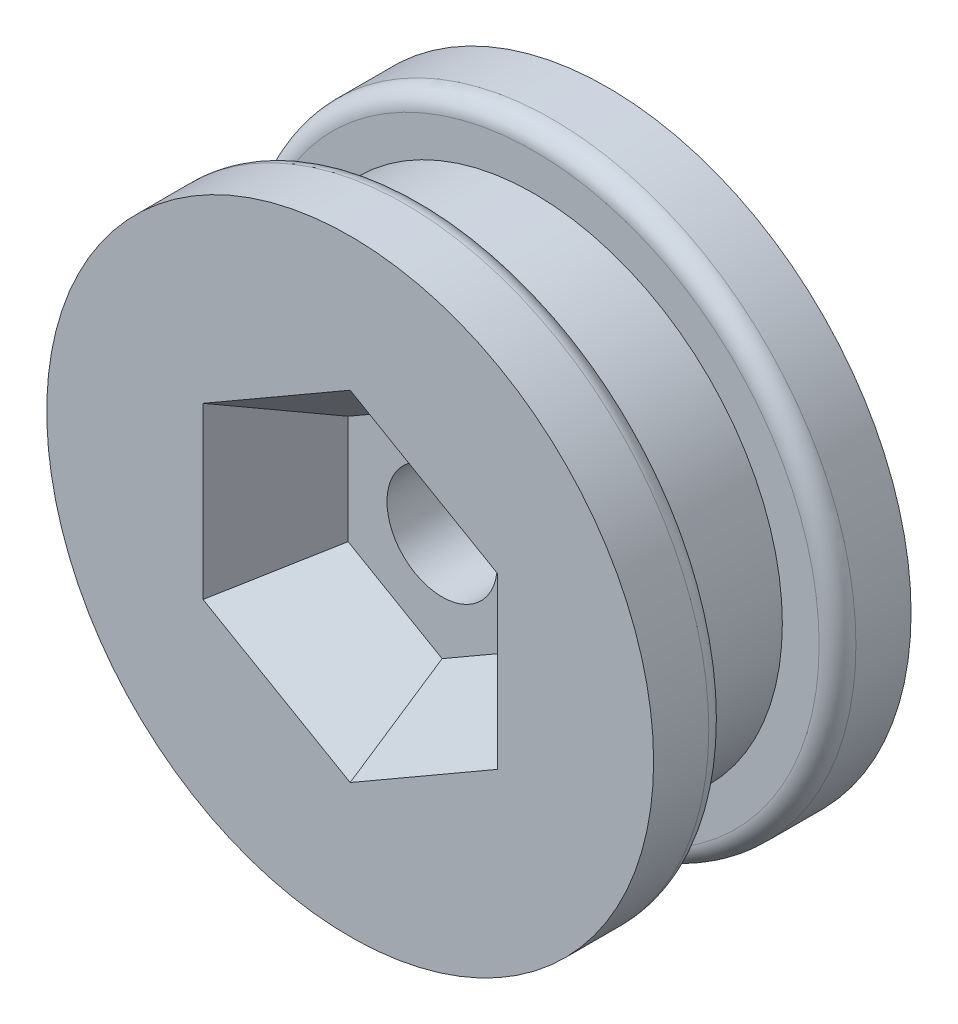
ISO-10303-21;
HEADER;
FILE_DESCRIPTION(('STEP AP214'),'2;1');
FILE_NAME('part.step','',(''),(''),'','','');
FILE_SCHEMA(('AUTOMOTIVE_DESIGN { 1 0 10303 214 1 1 1 1 }'));
ENDSEC;
DATA;
#1=APPLICATION_CONTEXT('core data for automotive mechanical design processes');
#2=APPLICATION_PROTOCOL_DEFINITION('international standard','automotive_design',2000,#1);
#3=PRODUCT_CONTEXT('',#1,'mechanical');
#4=PRODUCT('Part','Part','',(#3));
#5=PRODUCT_RELATED_PRODUCT_CATEGORY('part','',(#4));
#6=PRODUCT_DEFINITION_FORMATION('','',#4);
#7=PRODUCT_DEFINITION_CONTEXT('part definition',#1,'design');
#8=PRODUCT_DEFINITION('design','',#6,#7);
#9=PRODUCT_DEFINITION_SHAPE('','',#8);
#10=(LENGTH_UNIT() NAMED_UNIT(*) SI_UNIT(.MILLI.,.METRE.));
#11=(NAMED_UNIT(*) PLANE_ANGLE_UNIT() SI_UNIT($,.RADIAN.));
#12=(NAMED_UNIT(*) SI_UNIT($,.STERADIAN.) SOLID_ANGLE_UNIT());
#13=UNCERTAINTY_MEASURE_WITH_UNIT(LENGTH_MEASURE(1.E-05),#10,'distance_accuracy_value','');
#14=(GEOMETRIC_REPRESENTATION_CONTEXT(3) GLOBAL_UNCERTAINTY_ASSIGNED_CONTEXT((#13)) GLOBAL_UNIT_ASSIGNED_CONTEXT((#10,
#11,#12)) REPRESENTATION_CONTEXT('',''));
#15=CARTESIAN_POINT('',(0.,0.,0.));
#16=DIRECTION('',(0.,0.,1.));
#17=DIRECTION('',(1.,0.,0.));
#18=AXIS2_PLACEMENT_3D('',#15,#16,#17);
#19=CARTESIAN_POINT('',(0.,0.,0.));
#20=DIRECTION('',(0.,0.,1.));
#21=DIRECTION('',(1.,0.,0.));
#22=AXIS2_PLACEMENT_3D('',#19,#20,#21);
#23=CYLINDRICAL_SURFACE('',#22,3.);
#24=CARTESIAN_POINT('',(0.,0.,-2.));
#25=DIRECTION('',(0.,0.,-1.));
#26=DIRECTION('',(-1.,0.,0.));
#27=AXIS2_PLACEMENT_3D('',#24,#25,#26);
#28=CIRCLE('',#27,3.);
#29=CARTESIAN_POINT('',(-3.,0.,-2.));
#30=VERTEX_POINT('',#29);
#31=EDGE_CURVE('E198',#30,#30,#28,.F.);
#32=ORIENTED_EDGE('',*,*,#31,.F.);
#33=EDGE_LOOP('',(#32));
#34=FACE_BOUND('',#33,.T.);
#35=CARTESIAN_POINT('',(0.,0.,2.));
#36=DIRECTION('',(0.,0.,1.));
#37=DIRECTION('',(1.,0.,0.));
#38=AXIS2_PLACEMENT_3D('',#35,#36,#37);
#39=CIRCLE('',#38,3.);
#40=CARTESIAN_POINT('',(3.,0.,2.));
#41=VERTEX_POINT('',#40);
#42=EDGE_CURVE('E38',#41,#41,#39,.F.);
#43=ORIENTED_EDGE('',*,*,#42,.F.);
#44=EDGE_LOOP('',(#43));
#45=FACE_BOUND('',#44,.T.);
#46=ADVANCED_FACE('F34',(#34,#45),#23,.F.);
#47=CARTESIAN_POINT('',(0.,0.,7.));
#48=DIRECTION('',(0.,0.,1.));
#49=DIRECTION('',(1.,0.,0.));
#50=AXIS2_PLACEMENT_3D('',#47,#48,#49);
#51=PLANE('',#50);
#52=CARTESIAN_POINT('',(0.,0.,7.));
#53=DIRECTION('',(0.,0.,1.));
#54=DIRECTION('',(1.,0.,0.));
#55=AXIS2_PLACEMENT_3D('',#52,#53,#54);
#56=CIRCLE('',#55,16.5);
#57=CARTESIAN_POINT('',(16.5,0.,7.));
#58=VERTEX_POINT('',#57);
#59=EDGE_CURVE('E226',#58,#58,#56,.T.);
#60=ORIENTED_EDGE('',*,*,#59,.T.);
#61=EDGE_LOOP('',(#60));
#62=FACE_BOUND('',#61,.T.);
#63=DIRECTION('',(0.,1.,0.));
#64=VECTOR('',#63,1.);
#65=CARTESIAN_POINT('',(-7.99999999999999,-4.61880215351701,7.));
#66=LINE('',#65,#64);
#67=CARTESIAN_POINT('',(-7.99999999999999,-4.61880215351701,7.));
#68=VERTEX_POINT('',#67);
#69=CARTESIAN_POINT('',(-7.99999999999999,4.61880215351701,7.));
#70=VERTEX_POINT('',#69);
#71=EDGE_CURVE('E142',#68,#70,#66,.T.);
#72=ORIENTED_EDGE('',*,*,#71,.T.);
#73=DIRECTION('',(0.866025403784439,0.5,0.));
#74=VECTOR('',#73,1.);
#75=CARTESIAN_POINT('',(-7.99999999999999,4.61880215351701,7.));
#76=LINE('',#75,#74);
#77=CARTESIAN_POINT('',(0.,9.23760430703401,7.));
#78=VERTEX_POINT('',#77);
#79=EDGE_CURVE('E51',#70,#78,#76,.T.);
#80=ORIENTED_EDGE('',*,*,#79,.T.);
#81=DIRECTION('',(0.866025403784438,-0.5,0.));
#82=VECTOR('',#81,1.);
#83=CARTESIAN_POINT('',(0.,9.23760430703401,7.));
#84=LINE('',#83,#82);
#85=CARTESIAN_POINT('',(8.,4.618802153517,7.));
#86=VERTEX_POINT('',#85);
#87=EDGE_CURVE('E156',#78,#86,#84,.T.);
#88=ORIENTED_EDGE('',*,*,#87,.T.);
#89=DIRECTION('',(0.,-1.,0.));
#90=VECTOR('',#89,1.);
#91=CARTESIAN_POINT('',(8.,4.618802153517,7.));
#92=LINE('',#91,#90);
#93=CARTESIAN_POINT('',(8.,-4.61880215351701,7.));
#94=VERTEX_POINT('',#93);
#95=EDGE_CURVE('E151',#86,#94,#92,.T.);
#96=ORIENTED_EDGE('',*,*,#95,.T.);
#97=DIRECTION('',(-0.866025403784439,-0.5,0.));
#98=VECTOR('',#97,1.);
#99=CARTESIAN_POINT('',(8.,-4.61880215351701,7.));
#100=LINE('',#99,#98);
#101=CARTESIAN_POINT('',(0.,-9.23760430703401,7.));
#102=VERTEX_POINT('',#101);
#103=EDGE_CURVE('E149',#94,#102,#100,.T.);
#104=ORIENTED_EDGE('',*,*,#103,.T.);
#105=DIRECTION('',(-0.866025403784439,0.5,0.));
#106=VECTOR('',#105,1.);
#107=CARTESIAN_POINT('',(0.,-9.23760430703401,7.));
#108=LINE('',#107,#106);
#109=EDGE_CURVE('E132',#102,#68,#108,.T.);
#110=ORIENTED_EDGE('',*,*,#109,.T.);
#111=EDGE_LOOP('',(#72,#80,#88,#96,#104,#110));
#112=FACE_BOUND('',#111,.T.);
#113=ADVANCED_FACE('F146',(#62,#112),#51,.T.);
#114=CARTESIAN_POINT('',(0.,0.,-7.));
#115=DIRECTION('',(0.,0.,1.));
#116=DIRECTION('',(1.,0.,0.));
#117=AXIS2_PLACEMENT_3D('',#114,#115,#116);
#118=PLANE('',#117);
#119=DIRECTION('',(0.866025403784438,-0.5,0.));
#120=VECTOR('',#119,1.);
#121=CARTESIAN_POINT('',(0.,9.23760430703401,-7.));
#122=LINE('',#121,#120);
#123=CARTESIAN_POINT('',(0.,9.23760430703401,-7.));
#124=VERTEX_POINT('',#123);
#125=CARTESIAN_POINT('',(8.,4.618802153517,-7.));
#126=VERTEX_POINT('',#125);
#127=EDGE_CURVE('E180',#124,#126,#122,.T.);
#128=ORIENTED_EDGE('',*,*,#127,.F.);
#129=DIRECTION('',(0.866025403784439,0.5,0.));
#130=VECTOR('',#129,1.);
#131=CARTESIAN_POINT('',(-7.99999999999999,4.61880215351701,-7.));
#132=LINE('',#131,#130);
#133=CARTESIAN_POINT('',(-7.99999999999999,4.61880215351701,-7.));
#134=VERTEX_POINT('',#133);
#135=EDGE_CURVE('E59',#134,#124,#132,.T.);
#136=ORIENTED_EDGE('',*,*,#135,.F.);
#137=DIRECTION('',(0.,1.,0.));
#138=VECTOR('',#137,1.);
#139=CARTESIAN_POINT('',(-7.99999999999999,-4.61880215351701,-7.));
#140=LINE('',#139,#138);
#141=CARTESIAN_POINT('',(-7.99999999999999,-4.61880215351701,-7.));
#142=VERTEX_POINT('',#141);
#143=EDGE_CURVE('E192',#142,#134,#140,.T.);
#144=ORIENTED_EDGE('',*,*,#143,.F.);
#145=DIRECTION('',(-0.866025403784439,0.5,0.));
#146=VECTOR('',#145,1.);
#147=CARTESIAN_POINT('',(0.,-9.23760430703401,-7.));
#148=LINE('',#147,#146);
#149=CARTESIAN_POINT('',(0.,-9.23760430703401,-7.));
#150=VERTEX_POINT('',#149);
#151=EDGE_CURVE('E189',#150,#142,#148,.T.);
#152=ORIENTED_EDGE('',*,*,#151,.F.);
#153=DIRECTION('',(-0.866025403784439,-0.5,0.));
#154=VECTOR('',#153,1.);
#155=CARTESIAN_POINT('',(8.,-4.61880215351701,-7.));
#156=LINE('',#155,#154);
#157=CARTESIAN_POINT('',(8.,-4.61880215351701,-7.));
#158=VERTEX_POINT('',#157);
#159=EDGE_CURVE('E186',#158,#150,#156,.T.);
#160=ORIENTED_EDGE('',*,*,#159,.F.);
#161=DIRECTION('',(0.,-1.,0.));
#162=VECTOR('',#161,1.);
#163=CARTESIAN_POINT('',(8.,4.618802153517,-7.));
#164=LINE('',#163,#162);
#165=EDGE_CURVE('E183',#126,#158,#164,.T.);
#166=ORIENTED_EDGE('',*,*,#165,.F.);
#167=EDGE_LOOP('',(#128,#136,#144,#152,#160,#166));
#168=FACE_BOUND('',#167,.T.);
#169=CARTESIAN_POINT('',(0.,0.,-7.));
#170=DIRECTION('',(0.,0.,1.));
#171=DIRECTION('',(1.,0.,0.));
#172=AXIS2_PLACEMENT_3D('',#169,#170,#171);
#173=CIRCLE('',#172,16.5);
#174=CARTESIAN_POINT('',(16.5,0.,-7.));
#175=VERTEX_POINT('',#174);
#176=EDGE_CURVE('E235',#175,#175,#173,.T.);
#177=ORIENTED_EDGE('',*,*,#176,.F.);
#178=EDGE_LOOP('',(#177));
#179=FACE_BOUND('',#178,.T.);
#180=ADVANCED_FACE('F311',(#168,#179),#118,.F.);
#181=CARTESIAN_POINT('',(0.,0.,0.));
#182=DIRECTION('',(0.,0.,1.));
#183=DIRECTION('',(1.,0.,0.));
#184=AXIS2_PLACEMENT_3D('',#181,#182,#183);
#185=CYLINDRICAL_SURFACE('',#184,16.5);
#186=CARTESIAN_POINT('',(0.,0.,-4.));
#187=DIRECTION('',(0.,0.,-1.));
#188=DIRECTION('',(-1.,0.,0.));
#189=AXIS2_PLACEMENT_3D('',#186,#187,#188);
#190=CIRCLE('',#189,16.5);
#191=CARTESIAN_POINT('',(-16.5,0.,-4.));
#192=VERTEX_POINT('',#191);
#193=EDGE_CURVE('E241',#192,#192,#190,.T.);
#194=ORIENTED_EDGE('',*,*,#193,.T.);
#195=EDGE_LOOP('',(#194));
#196=FACE_BOUND('',#195,.T.);
#197=ORIENTED_EDGE('',*,*,#176,.T.);
#198=EDGE_LOOP('',(#197));
#199=FACE_BOUND('',#198,.T.);
#200=ADVANCED_FACE('F329',(#196,#199),#185,.T.);
#201=CARTESIAN_POINT('',(0.,0.,-3.));
#202=DIRECTION('',(0.,0.,-1.));
#203=DIRECTION('',(-1.,0.,0.));
#204=AXIS2_PLACEMENT_3D('',#201,#202,#203);
#205=PLANE('',#204);
#206=CARTESIAN_POINT('',(0.,0.,-3.));
#207=DIRECTION('',(0.,0.,-1.));
#208=DIRECTION('',(-1.,0.,0.));
#209=AXIS2_PLACEMENT_3D('',#206,#207,#208);
#210=CIRCLE('',#209,15.5);
#211=CARTESIAN_POINT('',(-15.5,0.,-3.));
#212=VERTEX_POINT('',#211);
#213=EDGE_CURVE('E238',#212,#212,#210,.F.);
#214=ORIENTED_EDGE('',*,*,#213,.T.);
#215=EDGE_LOOP('',(#214));
#216=FACE_BOUND('',#215,.T.);
#217=CARTESIAN_POINT('',(0.,0.,-3.));
#218=DIRECTION('',(0.,0.,1.));
#219=DIRECTION('',(1.,0.,0.));
#220=AXIS2_PLACEMENT_3D('',#217,#218,#219);
#221=CIRCLE('',#220,13.5);
#222=CARTESIAN_POINT('',(13.5,0.,-3.));
#223=VERTEX_POINT('',#222);
#224=EDGE_CURVE('E232',#223,#223,#221,.T.);
#225=ORIENTED_EDGE('',*,*,#224,.F.);
#226=EDGE_LOOP('',(#225));
#227=FACE_BOUND('',#226,.T.);
#228=ADVANCED_FACE('F325',(#216,#227),#205,.F.);
#229=CARTESIAN_POINT('',(0.,0.,0.));
#230=DIRECTION('',(0.,0.,1.));
#231=DIRECTION('',(1.,0.,0.));
#232=AXIS2_PLACEMENT_3D('',#229,#230,#231);
#233=CYLINDRICAL_SURFACE('',#232,13.5);
#234=ORIENTED_EDGE('',*,*,#224,.T.);
#235=EDGE_LOOP('',(#234));
#236=FACE_BOUND('',#235,.T.);
#237=CARTESIAN_POINT('',(0.,0.,3.));
#238=DIRECTION('',(0.,0.,1.));
#239=DIRECTION('',(1.,0.,0.));
#240=AXIS2_PLACEMENT_3D('',#237,#238,#239);
#241=CIRCLE('',#240,13.5);
#242=CARTESIAN_POINT('',(13.5,0.,3.));
#243=VERTEX_POINT('',#242);
#244=EDGE_CURVE('E229',#243,#243,#241,.T.);
#245=ORIENTED_EDGE('',*,*,#244,.F.);
#246=EDGE_LOOP('',(#245));
#247=FACE_BOUND('',#246,.T.);
#248=ADVANCED_FACE('F321',(#236,#247),#233,.T.);
#249=CARTESIAN_POINT('',(0.,0.,3.));
#250=DIRECTION('',(0.,0.,-1.));
#251=DIRECTION('',(-1.,0.,0.));
#252=AXIS2_PLACEMENT_3D('',#249,#250,#251);
#253=PLANE('',#252);
#254=CARTESIAN_POINT('',(0.,0.,3.));
#255=DIRECTION('',(0.,0.,-1.));
#256=DIRECTION('',(-1.,0.,0.));
#257=AXIS2_PLACEMENT_3D('',#254,#255,#256);
#258=CIRCLE('',#257,15.5);
#259=CARTESIAN_POINT('',(-15.5,0.,3.));
#260=VERTEX_POINT('',#259);
#261=EDGE_CURVE('E11',#260,#260,#258,.T.);
#262=ORIENTED_EDGE('',*,*,#261,.T.);
#263=EDGE_LOOP('',(#262));
#264=FACE_BOUND('',#263,.T.);
#265=ORIENTED_EDGE('',*,*,#244,.T.);
#266=EDGE_LOOP('',(#265));
#267=FACE_BOUND('',#266,.T.);
#268=ADVANCED_FACE('F317',(#264,#267),#253,.T.);
#269=CARTESIAN_POINT('',(0.,0.,0.));
#270=DIRECTION('',(0.,0.,1.));
#271=DIRECTION('',(1.,0.,0.));
#272=AXIS2_PLACEMENT_3D('',#269,#270,#271);
#273=CYLINDRICAL_SURFACE('',#272,16.5);
#274=CARTESIAN_POINT('',(0.,0.,4.));
#275=DIRECTION('',(0.,0.,-1.));
#276=DIRECTION('',(-1.,0.,0.));
#277=AXIS2_PLACEMENT_3D('',#274,#275,#276);
#278=CIRCLE('',#277,16.5);
#279=CARTESIAN_POINT('',(-16.5,0.,4.));
#280=VERTEX_POINT('',#279);
#281=EDGE_CURVE('E43',#280,#280,#278,.F.);
#282=ORIENTED_EDGE('',*,*,#281,.T.);
#283=EDGE_LOOP('',(#282));
#284=FACE_BOUND('',#283,.T.);
#285=ORIENTED_EDGE('',*,*,#59,.F.);
#286=EDGE_LOOP('',(#285));
#287=FACE_BOUND('',#286,.T.);
#288=ADVANCED_FACE('F313',(#284,#287),#273,.T.);
#289=CARTESIAN_POINT('',(0.,0.,-4.));
#290=DIRECTION('',(0.,0.,-1.));
#291=DIRECTION('',(-1.,0.,0.));
#292=AXIS2_PLACEMENT_3D('',#289,#290,#291);
#293=TOROIDAL_SURFACE('',#292,15.5,1.);
#294=ORIENTED_EDGE('',*,*,#193,.F.);
#295=EDGE_LOOP('',(#294));
#296=FACE_BOUND('',#295,.T.);
#297=ORIENTED_EDGE('',*,*,#213,.F.);
#298=EDGE_LOOP('',(#297));
#299=FACE_BOUND('',#298,.T.);
#300=ADVANCED_FACE('F316',(#296,#299),#293,.T.);
#301=CARTESIAN_POINT('',(0.,0.,4.));
#302=DIRECTION('',(0.,0.,-1.));
#303=DIRECTION('',(-1.,0.,0.));
#304=AXIS2_PLACEMENT_3D('',#301,#302,#303);
#305=TOROIDAL_SURFACE('',#304,15.5,1.);
#306=ORIENTED_EDGE('',*,*,#261,.F.);
#307=EDGE_LOOP('',(#306));
#308=FACE_BOUND('',#307,.T.);
#309=ORIENTED_EDGE('',*,*,#281,.F.);
#310=EDGE_LOOP('',(#309));
#311=FACE_BOUND('',#310,.T.);
#312=ADVANCED_FACE('F36',(#308,#311),#305,.T.);
#313=CARTESIAN_POINT('',(0.,0.,-2.));
#314=DIRECTION('',(0.,0.,-1.));
#315=DIRECTION('',(-1.,0.,0.));
#316=AXIS2_PLACEMENT_3D('',#313,#314,#315);
#317=PLANE('',#316);
#318=DIRECTION('',(0.866025403784439,0.5,0.));
#319=VECTOR('',#318,1.);
#320=CARTESIAN_POINT('',(-2.55662432702593,4.4282032302755,-2.));
#321=LINE('',#320,#319);
#322=CARTESIAN_POINT('',(-5.11324865405185,2.95213548685034,-2.));
#323=VERTEX_POINT('',#322);
#324=CARTESIAN_POINT('',(0.,5.90427097370067,-2.));
#325=VERTEX_POINT('',#324);
#326=EDGE_CURVE('E195',#323,#325,#321,.T.);
#327=ORIENTED_EDGE('',*,*,#326,.T.);
#328=DIRECTION('',(0.866025403784438,-0.5,0.));
#329=VECTOR('',#328,1.);
#330=CARTESIAN_POINT('',(2.55662432702593,4.4282032302755,-2.));
#331=LINE('',#330,#329);
#332=CARTESIAN_POINT('',(5.11324865405186,2.95213548685033,-2.));
#333=VERTEX_POINT('',#332);
#334=EDGE_CURVE('E212',#325,#333,#331,.T.);
#335=ORIENTED_EDGE('',*,*,#334,.T.);
#336=DIRECTION('',(0.,-1.,0.));
#337=VECTOR('',#336,1.);
#338=CARTESIAN_POINT('',(5.11324865405186,0.,-2.));
#339=LINE('',#338,#337);
#340=CARTESIAN_POINT('',(5.11324865405186,-2.95213548685034,-2.));
#341=VERTEX_POINT('',#340);
#342=EDGE_CURVE('E221',#333,#341,#339,.T.);
#343=ORIENTED_EDGE('',*,*,#342,.T.);
#344=DIRECTION('',(-0.866025403784439,-0.5,0.));
#345=VECTOR('',#344,1.);
#346=CARTESIAN_POINT('',(2.55662432702593,-4.4282032302755,-2.));
#347=LINE('',#346,#345);
#348=CARTESIAN_POINT('',(0.,-5.90427097370067,-2.));
#349=VERTEX_POINT('',#348);
#350=EDGE_CURVE('E218',#341,#349,#347,.T.);
#351=ORIENTED_EDGE('',*,*,#350,.T.);
#352=DIRECTION('',(-0.866025403784439,0.5,0.));
#353=VECTOR('',#352,1.);
#354=CARTESIAN_POINT('',(-2.55662432702593,-4.4282032302755,-2.));
#355=LINE('',#354,#353);
#356=CARTESIAN_POINT('',(-5.11324865405186,-2.95213548685034,-2.));
#357=VERTEX_POINT('',#356);
#358=EDGE_CURVE('E215',#349,#357,#355,.T.);
#359=ORIENTED_EDGE('',*,*,#358,.T.);
#360=DIRECTION('',(0.,1.,0.));
#361=VECTOR('',#360,1.);
#362=CARTESIAN_POINT('',(-5.11324865405185,0.,-2.));
#363=LINE('',#362,#361);
#364=EDGE_CURVE('E203',#357,#323,#363,.T.);
#365=ORIENTED_EDGE('',*,*,#364,.T.);
#366=EDGE_LOOP('',(#327,#335,#343,#351,#359,#365));
#367=FACE_BOUND('',#366,.T.);
#368=ORIENTED_EDGE('',*,*,#31,.T.);
#369=EDGE_LOOP('',(#368));
#370=FACE_BOUND('',#369,.T.);
#371=ADVANCED_FACE('F248',(#367,#370),#317,.T.);
#372=CARTESIAN_POINT('',(-7.99999999999999,4.61880215351701,-7.));
#373=DIRECTION('',(-0.433012701892219,0.75,0.500000000000001));
#374=DIRECTION('',(0.,-0.55470019622523,0.832050294337843));
#375=AXIS2_PLACEMENT_3D('',#372,#373,#374);
#376=PLANE('',#375);
#377=ORIENTED_EDGE('',*,*,#135,.T.);
#378=DIRECTION('',(0.,0.55470019622523,-0.832050294337843));
#379=VECTOR('',#378,1.);
#380=CARTESIAN_POINT('',(0.,7.81643441364416,-4.86824515991523));
#381=LINE('',#380,#379);
#382=EDGE_CURVE('E200',#325,#124,#381,.T.);
#383=ORIENTED_EDGE('',*,*,#382,.F.);
#384=ORIENTED_EDGE('',*,*,#326,.F.);
#385=DIRECTION('',(-0.480384461415262,0.277350098112615,-0.832050294337843));
#386=VECTOR('',#385,1.);
#387=CARTESIAN_POINT('',(-6.76923076923075,3.90821720682208,-4.86824515991522));
#388=LINE('',#387,#386);
#389=EDGE_CURVE('E196',#323,#134,#388,.T.);
#390=ORIENTED_EDGE('',*,*,#389,.T.);
#391=EDGE_LOOP('',(#377,#383,#384,#390));
#392=FACE_BOUND('',#391,.T.);
#393=ADVANCED_FACE('F290',(#392),#376,.F.);
#394=CARTESIAN_POINT('',(-7.99999999999999,-4.61880215351701,-7.));
#395=DIRECTION('',(-0.866025403784438,0.,0.500000000000001));
#396=DIRECTION('',(0.500000000000001,0.,0.866025403784438));
#397=AXIS2_PLACEMENT_3D('',#394,#395,#396);
#398=PLANE('',#397);
#399=ORIENTED_EDGE('',*,*,#143,.T.);
#400=ORIENTED_EDGE('',*,*,#389,.F.);
#401=ORIENTED_EDGE('',*,*,#364,.F.);
#402=DIRECTION('',(-0.480384461415262,-0.277350098112615,-0.832050294337843));
#403=VECTOR('',#402,1.);
#404=CARTESIAN_POINT('',(-6.76923076923076,-3.90821720682208,-4.86824515991523));
#405=LINE('',#404,#403);
#406=EDGE_CURVE('E199',#357,#142,#405,.T.);
#407=ORIENTED_EDGE('',*,*,#406,.T.);
#408=EDGE_LOOP('',(#399,#400,#401,#407));
#409=FACE_BOUND('',#408,.T.);
#410=ADVANCED_FACE('F293',(#409),#398,.F.);
#411=CARTESIAN_POINT('',(0.,-9.23760430703401,-7.));
#412=DIRECTION('',(-0.433012701892219,-0.75,0.500000000000001));
#413=DIRECTION('',(0.,-0.55470019622523,-0.832050294337843));
#414=AXIS2_PLACEMENT_3D('',#411,#412,#413);
#415=PLANE('',#414);
#416=ORIENTED_EDGE('',*,*,#151,.T.);
#417=ORIENTED_EDGE('',*,*,#406,.F.);
#418=ORIENTED_EDGE('',*,*,#358,.F.);
#419=DIRECTION('',(0.,-0.55470019622523,-0.832050294337843));
#420=VECTOR('',#419,1.);
#421=CARTESIAN_POINT('',(0.,-7.81643441364416,-4.86824515991523));
#422=LINE('',#421,#420);
#423=EDGE_CURVE('E207',#349,#150,#422,.T.);
#424=ORIENTED_EDGE('',*,*,#423,.T.);
#425=EDGE_LOOP('',(#416,#417,#418,#424));
#426=FACE_BOUND('',#425,.T.);
#427=ADVANCED_FACE('F301',(#426),#415,.F.);
#428=CARTESIAN_POINT('',(8.,-4.61880215351701,-7.));
#429=DIRECTION('',(0.433012701892219,-0.75,0.500000000000001));
#430=DIRECTION('',(0.,-0.55470019622523,-0.832050294337843));
#431=AXIS2_PLACEMENT_3D('',#428,#429,#430);
#432=PLANE('',#431);
#433=ORIENTED_EDGE('',*,*,#159,.T.);
#434=ORIENTED_EDGE('',*,*,#423,.F.);
#435=ORIENTED_EDGE('',*,*,#350,.F.);
#436=DIRECTION('',(0.480384461415262,-0.277350098112615,-0.832050294337843));
#437=VECTOR('',#436,1.);
#438=CARTESIAN_POINT('',(6.76923076923076,-3.90821720682208,-4.86824515991523));
#439=LINE('',#438,#437);
#440=EDGE_CURVE('E205',#341,#158,#439,.T.);
#441=ORIENTED_EDGE('',*,*,#440,.T.);
#442=EDGE_LOOP('',(#433,#434,#435,#441));
#443=FACE_BOUND('',#442,.T.);
#444=ADVANCED_FACE('F297',(#443),#432,.F.);
#445=CARTESIAN_POINT('',(8.,4.618802153517,-7.));
#446=DIRECTION('',(0.866025403784438,0.,0.500000000000001));
#447=DIRECTION('',(0.500000000000001,0.,-0.866025403784438));
#448=AXIS2_PLACEMENT_3D('',#445,#446,#447);
#449=PLANE('',#448);
#450=ORIENTED_EDGE('',*,*,#165,.T.);
#451=ORIENTED_EDGE('',*,*,#440,.F.);
#452=ORIENTED_EDGE('',*,*,#342,.F.);
#453=DIRECTION('',(0.480384461415262,0.277350098112615,-0.832050294337843));
#454=VECTOR('',#453,1.);
#455=CARTESIAN_POINT('',(6.76923076923076,3.90821720682208,-4.86824515991523));
#456=LINE('',#455,#454);
#457=EDGE_CURVE('E202',#333,#126,#456,.T.);
#458=ORIENTED_EDGE('',*,*,#457,.T.);
#459=EDGE_LOOP('',(#450,#451,#452,#458));
#460=FACE_BOUND('',#459,.T.);
#461=ADVANCED_FACE('F268',(#460),#449,.F.);
#462=CARTESIAN_POINT('',(0.,9.23760430703401,-7.));
#463=DIRECTION('',(0.433012701892219,0.749999999999999,0.500000000000001));
#464=DIRECTION('',(0.,-0.55470019622523,0.832050294337843));
#465=AXIS2_PLACEMENT_3D('',#462,#463,#464);
#466=PLANE('',#465);
#467=ORIENTED_EDGE('',*,*,#127,.T.);
#468=ORIENTED_EDGE('',*,*,#457,.F.);
#469=ORIENTED_EDGE('',*,*,#334,.F.);
#470=ORIENTED_EDGE('',*,*,#382,.T.);
#471=EDGE_LOOP('',(#467,#468,#469,#470));
#472=FACE_BOUND('',#471,.T.);
#473=ADVANCED_FACE('F259',(#472),#466,.F.);
#474=CARTESIAN_POINT('',(0.,0.,2.));
#475=DIRECTION('',(0.,0.,1.));
#476=DIRECTION('',(-1.,0.,0.));
#477=AXIS2_PLACEMENT_3D('',#474,#475,#476);
#478=PLANE('',#477);
#479=DIRECTION('',(-0.866025403784439,-0.5,0.));
#480=VECTOR('',#479,1.);
#481=CARTESIAN_POINT('',(-2.55662432702593,4.4282032302755,2.));
#482=LINE('',#481,#480);
#483=CARTESIAN_POINT('',(-5.11324865405185,2.95213548685034,2.));
#484=VERTEX_POINT('',#483);
#485=CARTESIAN_POINT('',(0.,5.90427097370067,2.));
#486=VERTEX_POINT('',#485);
#487=EDGE_CURVE('E159',#484,#486,#482,.F.);
#488=ORIENTED_EDGE('',*,*,#487,.F.);
#489=DIRECTION('',(0.,-1.,0.));
#490=VECTOR('',#489,1.);
#491=CARTESIAN_POINT('',(-5.11324865405185,0.,2.));
#492=LINE('',#491,#490);
#493=CARTESIAN_POINT('',(-5.11324865405186,-2.95213548685034,2.));
#494=VERTEX_POINT('',#493);
#495=EDGE_CURVE('E171',#494,#484,#492,.F.);
#496=ORIENTED_EDGE('',*,*,#495,.F.);
#497=DIRECTION('',(0.866025403784439,-0.5,0.));
#498=VECTOR('',#497,1.);
#499=CARTESIAN_POINT('',(-2.55662432702593,-4.4282032302755,2.));
#500=LINE('',#499,#498);
#501=CARTESIAN_POINT('',(0.,-5.90427097370067,2.));
#502=VERTEX_POINT('',#501);
#503=EDGE_CURVE('E135',#502,#494,#500,.F.);
#504=ORIENTED_EDGE('',*,*,#503,.F.);
#505=DIRECTION('',(0.866025403784439,0.5,0.));
#506=VECTOR('',#505,1.);
#507=CARTESIAN_POINT('',(2.55662432702593,-4.4282032302755,2.));
#508=LINE('',#507,#506);
#509=CARTESIAN_POINT('',(5.11324865405186,-2.95213548685034,2.));
#510=VERTEX_POINT('',#509);
#511=EDGE_CURVE('E175',#510,#502,#508,.F.);
#512=ORIENTED_EDGE('',*,*,#511,.F.);
#513=DIRECTION('',(0.,1.,0.));
#514=VECTOR('',#513,1.);
#515=CARTESIAN_POINT('',(5.11324865405186,0.,2.));
#516=LINE('',#515,#514);
#517=CARTESIAN_POINT('',(5.11324865405186,2.95213548685033,2.));
#518=VERTEX_POINT('',#517);
#519=EDGE_CURVE('E173',#518,#510,#516,.F.);
#520=ORIENTED_EDGE('',*,*,#519,.F.);
#521=DIRECTION('',(-0.866025403784438,0.5,0.));
#522=VECTOR('',#521,1.);
#523=CARTESIAN_POINT('',(2.55662432702593,4.4282032302755,2.));
#524=LINE('',#523,#522);
#525=EDGE_CURVE('E163',#486,#518,#524,.F.);
#526=ORIENTED_EDGE('',*,*,#525,.F.);
#527=EDGE_LOOP('',(#488,#496,#504,#512,#520,#526));
#528=FACE_BOUND('',#527,.T.);
#529=ORIENTED_EDGE('',*,*,#42,.T.);
#530=EDGE_LOOP('',(#529));
#531=FACE_BOUND('',#530,.T.);
#532=ADVANCED_FACE('F256',(#528,#531),#478,.T.);
#533=CARTESIAN_POINT('',(-7.99999999999999,4.61880215351701,7.));
#534=DIRECTION('',(-0.433012701892219,0.75,-0.500000000000001));
#535=DIRECTION('',(0.,0.55470019622523,0.832050294337843));
#536=AXIS2_PLACEMENT_3D('',#533,#534,#535);
#537=PLANE('',#536);
#538=ORIENTED_EDGE('',*,*,#79,.F.);
#539=DIRECTION('',(-0.480384461415262,0.277350098112615,0.832050294337843));
#540=VECTOR('',#539,1.);
#541=CARTESIAN_POINT('',(-7.99999999999999,4.61880215351701,7.));
#542=LINE('',#541,#540);
#543=EDGE_CURVE('E139',#484,#70,#542,.T.);
#544=ORIENTED_EDGE('',*,*,#543,.F.);
#545=ORIENTED_EDGE('',*,*,#487,.T.);
#546=DIRECTION('',(0.,0.55470019622523,0.832050294337843));
#547=VECTOR('',#546,1.);
#548=CARTESIAN_POINT('',(0.,9.23760430703401,7.));
#549=LINE('',#548,#547);
#550=EDGE_CURVE('E160',#486,#78,#549,.T.);
#551=ORIENTED_EDGE('',*,*,#550,.T.);
#552=EDGE_LOOP('',(#538,#544,#545,#551));
#553=FACE_BOUND('',#552,.T.);
#554=ADVANCED_FACE('F258',(#553),#537,.F.);
#555=CARTESIAN_POINT('',(0.,9.23760430703401,7.));
#556=DIRECTION('',(0.433012701892219,0.749999999999999,-0.500000000000001));
#557=DIRECTION('',(0.,0.55470019622523,0.832050294337843));
#558=AXIS2_PLACEMENT_3D('',#555,#556,#557);
#559=PLANE('',#558);
#560=ORIENTED_EDGE('',*,*,#87,.F.);
#561=ORIENTED_EDGE('',*,*,#550,.F.);
#562=ORIENTED_EDGE('',*,*,#525,.T.);
#563=DIRECTION('',(0.480384461415262,0.277350098112615,0.832050294337843));
#564=VECTOR('',#563,1.);
#565=CARTESIAN_POINT('',(8.,4.618802153517,7.));
#566=LINE('',#565,#564);
#567=EDGE_CURVE('E162',#518,#86,#566,.T.);
#568=ORIENTED_EDGE('',*,*,#567,.T.);
#569=EDGE_LOOP('',(#560,#561,#562,#568));
#570=FACE_BOUND('',#569,.T.);
#571=ADVANCED_FACE('F266',(#570),#559,.F.);
#572=CARTESIAN_POINT('',(8.,4.618802153517,7.));
#573=DIRECTION('',(0.866025403784438,0.,-0.500000000000001));
#574=DIRECTION('',(-0.500000000000001,0.,-0.866025403784438));
#575=AXIS2_PLACEMENT_3D('',#572,#573,#574);
#576=PLANE('',#575);
#577=ORIENTED_EDGE('',*,*,#95,.F.);
#578=ORIENTED_EDGE('',*,*,#567,.F.);
#579=ORIENTED_EDGE('',*,*,#519,.T.);
#580=DIRECTION('',(0.480384461415262,-0.277350098112615,0.832050294337843));
#581=VECTOR('',#580,1.);
#582=CARTESIAN_POINT('',(8.,-4.61880215351701,7.));
#583=LINE('',#582,#581);
#584=EDGE_CURVE('E166',#510,#94,#583,.T.);
#585=ORIENTED_EDGE('',*,*,#584,.T.);
#586=EDGE_LOOP('',(#577,#578,#579,#585));
#587=FACE_BOUND('',#586,.T.);
#588=ADVANCED_FACE('F280',(#587),#576,.F.);
#589=CARTESIAN_POINT('',(8.,-4.61880215351701,7.));
#590=DIRECTION('',(0.433012701892219,-0.75,-0.500000000000001));
#591=DIRECTION('',(0.,0.55470019622523,-0.832050294337843));
#592=AXIS2_PLACEMENT_3D('',#589,#590,#591);
#593=PLANE('',#592);
#594=ORIENTED_EDGE('',*,*,#103,.F.);
#595=ORIENTED_EDGE('',*,*,#584,.F.);
#596=ORIENTED_EDGE('',*,*,#511,.T.);
#597=DIRECTION('',(0.,-0.55470019622523,0.832050294337843));
#598=VECTOR('',#597,1.);
#599=CARTESIAN_POINT('',(0.,-9.23760430703401,7.));
#600=LINE('',#599,#598);
#601=EDGE_CURVE('E138',#502,#102,#600,.T.);
#602=ORIENTED_EDGE('',*,*,#601,.T.);
#603=EDGE_LOOP('',(#594,#595,#596,#602));
#604=FACE_BOUND('',#603,.T.);
#605=ADVANCED_FACE('F277',(#604),#593,.F.);
#606=CARTESIAN_POINT('',(0.,-9.23760430703401,7.));
#607=DIRECTION('',(-0.433012701892219,-0.75,-0.500000000000001));
#608=DIRECTION('',(0.,0.55470019622523,-0.832050294337843));
#609=AXIS2_PLACEMENT_3D('',#606,#607,#608);
#610=PLANE('',#609);
#611=ORIENTED_EDGE('',*,*,#109,.F.);
#612=ORIENTED_EDGE('',*,*,#601,.F.);
#613=ORIENTED_EDGE('',*,*,#503,.T.);
#614=DIRECTION('',(-0.480384461415262,-0.277350098112615,0.832050294337843));
#615=VECTOR('',#614,1.);
#616=CARTESIAN_POINT('',(-7.99999999999999,-4.61880215351701,7.));
#617=LINE('',#616,#615);
#618=EDGE_CURVE('E127',#494,#68,#617,.T.);
#619=ORIENTED_EDGE('',*,*,#618,.T.);
#620=EDGE_LOOP('',(#611,#612,#613,#619));
#621=FACE_BOUND('',#620,.T.);
#622=ADVANCED_FACE('F129',(#621),#610,.F.);
#623=CARTESIAN_POINT('',(-7.99999999999999,-4.61880215351701,7.));
#624=DIRECTION('',(-0.866025403784438,0.,-0.500000000000001));
#625=DIRECTION('',(-0.500000000000001,0.,0.866025403784438));
#626=AXIS2_PLACEMENT_3D('',#623,#624,#625);
#627=PLANE('',#626);
#628=ORIENTED_EDGE('',*,*,#71,.F.);
#629=ORIENTED_EDGE('',*,*,#618,.F.);
#630=ORIENTED_EDGE('',*,*,#495,.T.);
#631=ORIENTED_EDGE('',*,*,#543,.T.);
#632=EDGE_LOOP('',(#628,#629,#630,#631));
#633=FACE_BOUND('',#632,.T.);
#634=ADVANCED_FACE('F143',(#633),#627,.F.);
#635=CLOSED_SHELL('',(#46,#113,#180,#200,#228,#248,#268,#288,#300,#312,#371,#393,#410,#427,#444,
#461,#473,#532,#554,#571,#588,#605,#622,#634));
#636=MANIFOLD_SOLID_BREP('B2',#635);
#637=ADVANCED_BREP_SHAPE_REPRESENTATION('',(#18,#636),#14);
#638=SHAPE_DEFINITION_REPRESENTATION(#9,#637);
ENDSEC;
END-ISO-10303-21;
